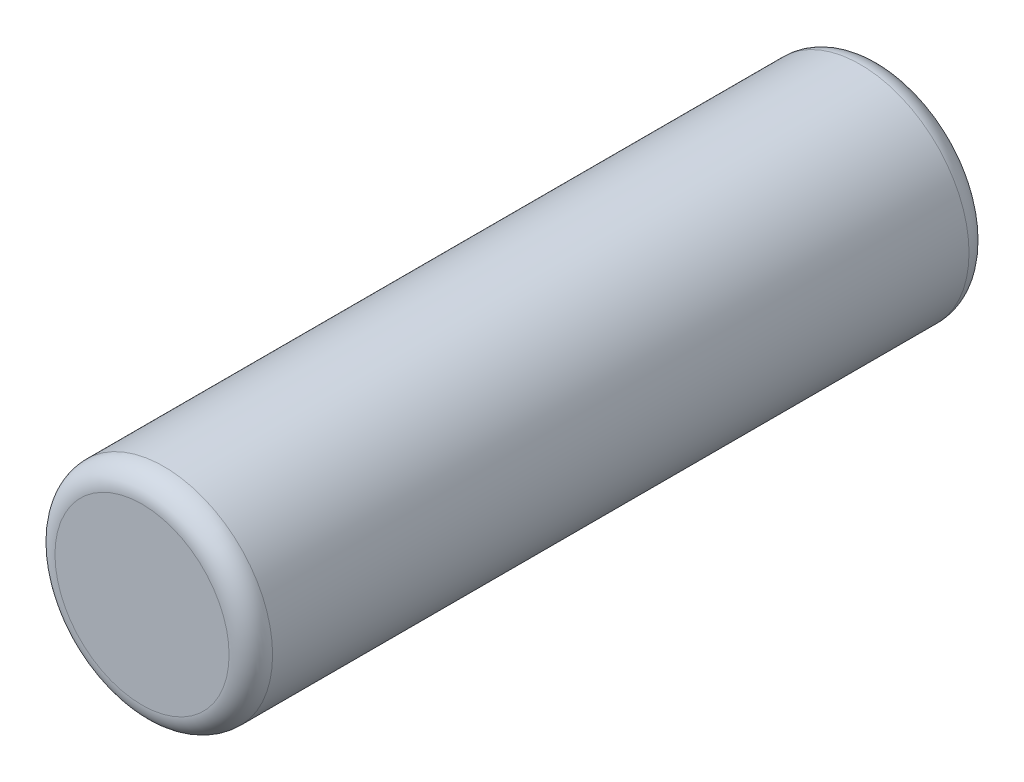
ISO-10303-21;
HEADER;
FILE_DESCRIPTION(('STEP AP214'),'2;1');
FILE_NAME('part.step','',(''),(''),'','','');
FILE_SCHEMA(('AUTOMOTIVE_DESIGN { 1 0 10303 214 1 1 1 1 }'));
ENDSEC;
DATA;
#1=APPLICATION_CONTEXT('core data for automotive mechanical design processes');
#2=APPLICATION_PROTOCOL_DEFINITION('international standard','automotive_design',2000,#1);
#3=PRODUCT_CONTEXT('',#1,'mechanical');
#4=PRODUCT('Part','Part','',(#3));
#5=PRODUCT_RELATED_PRODUCT_CATEGORY('part','',(#4));
#6=PRODUCT_DEFINITION_FORMATION('','',#4);
#7=PRODUCT_DEFINITION_CONTEXT('part definition',#1,'design');
#8=PRODUCT_DEFINITION('design','',#6,#7);
#9=PRODUCT_DEFINITION_SHAPE('','',#8);
#10=(LENGTH_UNIT() NAMED_UNIT(*) SI_UNIT(.MILLI.,.METRE.));
#11=(NAMED_UNIT(*) PLANE_ANGLE_UNIT() SI_UNIT($,.RADIAN.));
#12=(NAMED_UNIT(*) SI_UNIT($,.STERADIAN.) SOLID_ANGLE_UNIT());
#13=UNCERTAINTY_MEASURE_WITH_UNIT(LENGTH_MEASURE(1.E-05),#10,'distance_accuracy_value','');
#14=(GEOMETRIC_REPRESENTATION_CONTEXT(3) GLOBAL_UNCERTAINTY_ASSIGNED_CONTEXT((#13)) GLOBAL_UNIT_ASSIGNED_CONTEXT((#10,
#11,#12)) REPRESENTATION_CONTEXT('',''));
#15=CARTESIAN_POINT('',(0.,0.,0.));
#16=DIRECTION('',(0.,0.,1.));
#17=DIRECTION('',(1.,0.,0.));
#18=AXIS2_PLACEMENT_3D('',#15,#16,#17);
#19=CARTESIAN_POINT('',(0.,0.,34.));
#20=DIRECTION('',(0.,0.,-1.));
#21=DIRECTION('',(-1.,0.,0.));
#22=AXIS2_PLACEMENT_3D('',#19,#20,#21);
#23=CYLINDRICAL_SURFACE('',#22,10.);
#24=CARTESIAN_POINT('',(0.,0.,-32.));
#25=DIRECTION('',(0.,0.,1.));
#26=DIRECTION('',(1.,0.,0.));
#27=AXIS2_PLACEMENT_3D('',#24,#25,#26);
#28=CIRCLE('',#27,10.);
#29=CARTESIAN_POINT('',(10.,0.,-32.));
#30=VERTEX_POINT('',#29);
#31=EDGE_CURVE('E56',#30,#30,#28,.T.);
#32=ORIENTED_EDGE('',*,*,#31,.T.);
#33=EDGE_LOOP('',(#32));
#34=FACE_BOUND('',#33,.T.);
#35=CARTESIAN_POINT('',(0.,0.,32.));
#36=DIRECTION('',(0.,0.,1.));
#37=DIRECTION('',(1.,0.,0.));
#38=AXIS2_PLACEMENT_3D('',#35,#36,#37);
#39=CIRCLE('',#38,10.);
#40=CARTESIAN_POINT('',(10.,0.,32.));
#41=VERTEX_POINT('',#40);
#42=EDGE_CURVE('E61',#41,#41,#39,.F.);
#43=ORIENTED_EDGE('',*,*,#42,.T.);
#44=EDGE_LOOP('',(#43));
#45=FACE_BOUND('',#44,.T.);
#46=ADVANCED_FACE('F43',(#34,#45),#23,.T.);
#47=CARTESIAN_POINT('',(0.,0.,34.));
#48=DIRECTION('',(0.,0.,1.));
#49=DIRECTION('',(1.,0.,0.));
#50=AXIS2_PLACEMENT_3D('',#47,#48,#49);
#51=PLANE('',#50);
#52=CARTESIAN_POINT('',(0.,0.,34.));
#53=DIRECTION('',(0.,0.,1.));
#54=DIRECTION('',(1.,0.,0.));
#55=AXIS2_PLACEMENT_3D('',#52,#53,#54);
#56=CIRCLE('',#55,8.);
#57=CARTESIAN_POINT('',(8.,0.,34.));
#58=VERTEX_POINT('',#57);
#59=EDGE_CURVE('E10',#58,#58,#56,.T.);
#60=ORIENTED_EDGE('',*,*,#59,.T.);
#61=EDGE_LOOP('',(#60));
#62=FACE_BOUND('',#61,.T.);
#63=ADVANCED_FACE('F78',(#62),#51,.T.);
#64=CARTESIAN_POINT('',(0.,0.,-34.));
#65=DIRECTION('',(0.,0.,1.));
#66=DIRECTION('',(1.,0.,0.));
#67=AXIS2_PLACEMENT_3D('',#64,#65,#66);
#68=PLANE('',#67);
#69=CARTESIAN_POINT('',(0.,0.,-34.));
#70=DIRECTION('',(0.,0.,1.));
#71=DIRECTION('',(1.,0.,0.));
#72=AXIS2_PLACEMENT_3D('',#69,#70,#71);
#73=CIRCLE('',#72,8.);
#74=CARTESIAN_POINT('',(8.,0.,-34.));
#75=VERTEX_POINT('',#74);
#76=EDGE_CURVE('E51',#75,#75,#73,.F.);
#77=ORIENTED_EDGE('',*,*,#76,.T.);
#78=EDGE_LOOP('',(#77));
#79=FACE_BOUND('',#78,.T.);
#80=ADVANCED_FACE('F75',(#79),#68,.F.);
#81=CARTESIAN_POINT('',(0.,0.,-32.));
#82=DIRECTION('',(0.,0.,1.));
#83=DIRECTION('',(1.,0.,0.));
#84=AXIS2_PLACEMENT_3D('',#81,#82,#83);
#85=TOROIDAL_SURFACE('',#84,8.,2.);
#86=ORIENTED_EDGE('',*,*,#76,.F.);
#87=EDGE_LOOP('',(#86));
#88=FACE_BOUND('',#87,.T.);
#89=ORIENTED_EDGE('',*,*,#31,.F.);
#90=EDGE_LOOP('',(#89));
#91=FACE_BOUND('',#90,.T.);
#92=ADVANCED_FACE('F71',(#88,#91),#85,.T.);
#93=CARTESIAN_POINT('',(0.,0.,32.));
#94=DIRECTION('',(0.,0.,1.));
#95=DIRECTION('',(1.,0.,0.));
#96=AXIS2_PLACEMENT_3D('',#93,#94,#95);
#97=TOROIDAL_SURFACE('',#96,8.,2.);
#98=ORIENTED_EDGE('',*,*,#42,.F.);
#99=EDGE_LOOP('',(#98));
#100=FACE_BOUND('',#99,.T.);
#101=ORIENTED_EDGE('',*,*,#59,.F.);
#102=EDGE_LOOP('',(#101));
#103=FACE_BOUND('',#102,.T.);
#104=ADVANCED_FACE('F45',(#100,#103),#97,.T.);
#105=CLOSED_SHELL('',(#46,#63,#80,#92,#104));
#106=MANIFOLD_SOLID_BREP('B2',#105);
#107=ADVANCED_BREP_SHAPE_REPRESENTATION('',(#18,#106),#14);
#108=SHAPE_DEFINITION_REPRESENTATION(#9,#107);
ENDSEC;
END-ISO-10303-21;
